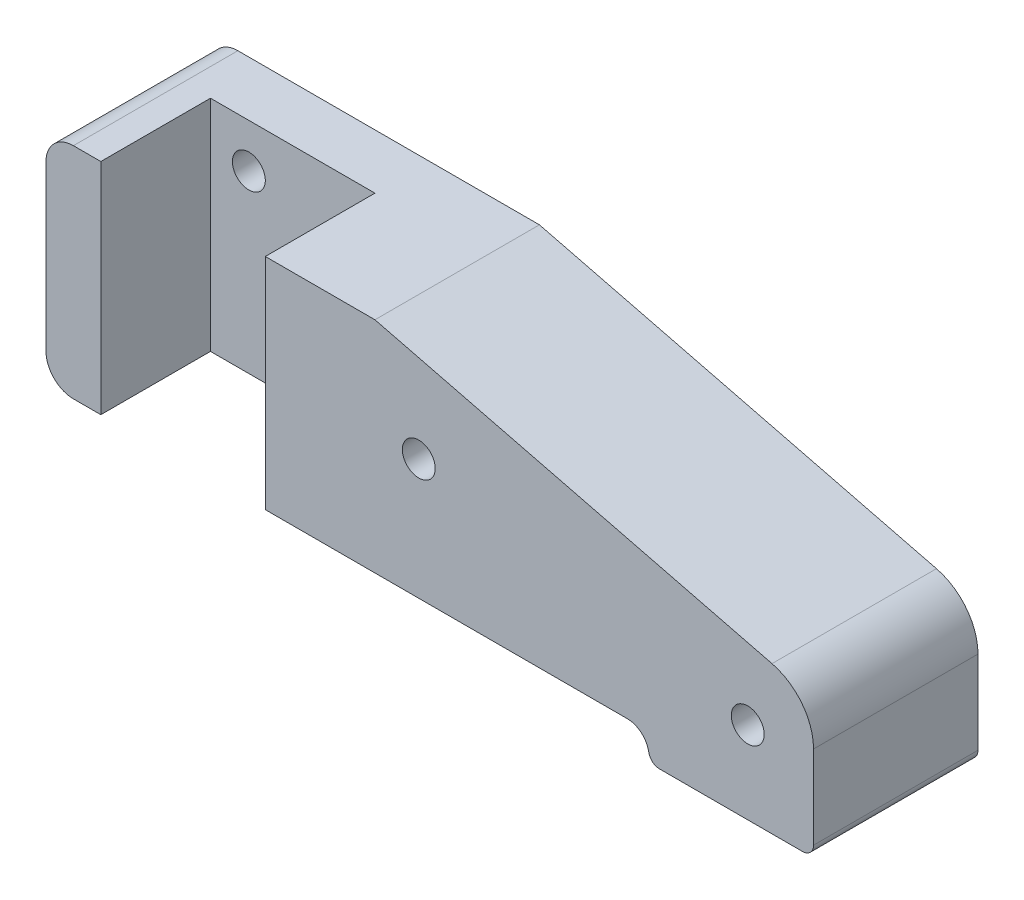
ISO-10303-21;
HEADER;
FILE_DESCRIPTION(('STEP AP214'),'2;1');
FILE_NAME('part.step','',(''),(''),'','','');
FILE_SCHEMA(('AUTOMOTIVE_DESIGN { 1 0 10303 214 1 1 1 1 }'));
ENDSEC;
DATA;
#1=APPLICATION_CONTEXT('core data for automotive mechanical design processes');
#2=APPLICATION_PROTOCOL_DEFINITION('international standard','automotive_design',2000,#1);
#3=PRODUCT_CONTEXT('',#1,'mechanical');
#4=PRODUCT('Part','Part','',(#3));
#5=PRODUCT_RELATED_PRODUCT_CATEGORY('part','',(#4));
#6=PRODUCT_DEFINITION_FORMATION('','',#4);
#7=PRODUCT_DEFINITION_CONTEXT('part definition',#1,'design');
#8=PRODUCT_DEFINITION('design','',#6,#7);
#9=PRODUCT_DEFINITION_SHAPE('','',#8);
#10=(LENGTH_UNIT() NAMED_UNIT(*) SI_UNIT(.MILLI.,.METRE.));
#11=(NAMED_UNIT(*) PLANE_ANGLE_UNIT() SI_UNIT($,.RADIAN.));
#12=(NAMED_UNIT(*) SI_UNIT($,.STERADIAN.) SOLID_ANGLE_UNIT());
#13=UNCERTAINTY_MEASURE_WITH_UNIT(LENGTH_MEASURE(1.E-05),#10,'distance_accuracy_value','');
#14=(GEOMETRIC_REPRESENTATION_CONTEXT(3) GLOBAL_UNCERTAINTY_ASSIGNED_CONTEXT((#13)) GLOBAL_UNIT_ASSIGNED_CONTEXT((#10,
#11,#12)) REPRESENTATION_CONTEXT('',''));
#15=CARTESIAN_POINT('',(0.,0.,0.));
#16=DIRECTION('',(0.,0.,1.));
#17=DIRECTION('',(1.,0.,0.));
#18=AXIS2_PLACEMENT_3D('',#15,#16,#17);
#19=CARTESIAN_POINT('',(0.,0.,30.));
#20=DIRECTION('',(0.,0.,-1.));
#21=DIRECTION('',(-1.,0.,0.));
#22=AXIS2_PLACEMENT_3D('',#19,#20,#21);
#23=PLANE('',#22);
#24=DIRECTION('',(-1.,0.,0.));
#25=VECTOR('',#24,1.);
#26=CARTESIAN_POINT('',(0.,40.,30.));
#27=LINE('',#26,#25);
#28=CARTESIAN_POINT('',(10.,40.,30.));
#29=VERTEX_POINT('',#28);
#30=CARTESIAN_POINT('',(5.,40.,30.));
#31=VERTEX_POINT('',#30);
#32=EDGE_CURVE('E184',#29,#31,#27,.T.);
#33=ORIENTED_EDGE('',*,*,#32,.T.);
#34=CARTESIAN_POINT('',(5.,35.,30.));
#35=DIRECTION('',(0.,0.,-1.));
#36=DIRECTION('',(-1.,0.,0.));
#37=AXIS2_PLACEMENT_3D('',#34,#35,#36);
#38=CIRCLE('',#37,5.);
#39=CARTESIAN_POINT('',(0.,35.,30.));
#40=VERTEX_POINT('',#39);
#41=EDGE_CURVE('E41',#31,#40,#38,.F.);
#42=ORIENTED_EDGE('',*,*,#41,.T.);
#43=DIRECTION('',(0.,-1.,0.));
#44=VECTOR('',#43,1.);
#45=CARTESIAN_POINT('',(0.,0.,30.));
#46=LINE('',#45,#44);
#47=CARTESIAN_POINT('',(0.,5.,30.));
#48=VERTEX_POINT('',#47);
#49=EDGE_CURVE('E172',#40,#48,#46,.T.);
#50=ORIENTED_EDGE('',*,*,#49,.T.);
#51=CARTESIAN_POINT('',(5.,5.,30.));
#52=DIRECTION('',(0.,0.,-1.));
#53=DIRECTION('',(-1.,0.,0.));
#54=AXIS2_PLACEMENT_3D('',#51,#52,#53);
#55=CIRCLE('',#54,5.);
#56=CARTESIAN_POINT('',(5.,0.,30.));
#57=VERTEX_POINT('',#56);
#58=EDGE_CURVE('E48',#48,#57,#55,.F.);
#59=ORIENTED_EDGE('',*,*,#58,.T.);
#60=DIRECTION('',(1.,0.,0.));
#61=VECTOR('',#60,1.);
#62=CARTESIAN_POINT('',(0.,0.,30.));
#63=LINE('',#62,#61);
#64=CARTESIAN_POINT('',(10.,0.,30.));
#65=VERTEX_POINT('',#64);
#66=EDGE_CURVE('E346',#57,#65,#63,.T.);
#67=ORIENTED_EDGE('',*,*,#66,.T.);
#68=DIRECTION('',(0.,-1.,0.));
#69=VECTOR('',#68,1.);
#70=CARTESIAN_POINT('',(10.,0.,30.));
#71=LINE('',#70,#69);
#72=EDGE_CURVE('E327',#29,#65,#71,.T.);
#73=ORIENTED_EDGE('',*,*,#72,.F.);
#74=EDGE_LOOP('',(#33,#42,#50,#59,#67,#73));
#75=FACE_BOUND('',#74,.T.);
#76=ADVANCED_FACE('F33',(#75),#23,.F.);
#77=CARTESIAN_POINT('',(0.,0.,30.));
#78=DIRECTION('',(1.,0.,0.));
#79=DIRECTION('',(0.,0.,-1.));
#80=AXIS2_PLACEMENT_3D('',#77,#78,#79);
#81=PLANE('',#80);
#82=ORIENTED_EDGE('',*,*,#49,.F.);
#83=DIRECTION('',(0.,0.,-1.));
#84=VECTOR('',#83,1.);
#85=CARTESIAN_POINT('',(0.,35.,30.));
#86=LINE('',#85,#84);
#87=CARTESIAN_POINT('',(0.,35.,0.));
#88=VERTEX_POINT('',#87);
#89=EDGE_CURVE('E241',#40,#88,#86,.T.);
#90=ORIENTED_EDGE('',*,*,#89,.T.);
#91=DIRECTION('',(0.,-1.,0.));
#92=VECTOR('',#91,1.);
#93=CARTESIAN_POINT('',(0.,0.,0.));
#94=LINE('',#93,#92);
#95=CARTESIAN_POINT('',(0.,5.,0.));
#96=VERTEX_POINT('',#95);
#97=EDGE_CURVE('E192',#88,#96,#94,.T.);
#98=ORIENTED_EDGE('',*,*,#97,.T.);
#99=DIRECTION('',(0.,0.,-1.));
#100=VECTOR('',#99,1.);
#101=CARTESIAN_POINT('',(0.,5.,30.));
#102=LINE('',#101,#100);
#103=EDGE_CURVE('E239',#96,#48,#102,.F.);
#104=ORIENTED_EDGE('',*,*,#103,.T.);
#105=EDGE_LOOP('',(#82,#90,#98,#104));
#106=FACE_BOUND('',#105,.T.);
#107=ADVANCED_FACE('F254',(#106),#81,.F.);
#108=CARTESIAN_POINT('',(0.,0.,30.));
#109=DIRECTION('',(0.,1.,0.));
#110=DIRECTION('',(0.,0.,1.));
#111=AXIS2_PLACEMENT_3D('',#108,#109,#110);
#112=PLANE('',#111);
#113=ORIENTED_EDGE('',*,*,#66,.F.);
#114=DIRECTION('',(0.,0.,-1.));
#115=VECTOR('',#114,1.);
#116=CARTESIAN_POINT('',(5.,0.,30.));
#117=LINE('',#116,#115);
#118=CARTESIAN_POINT('',(5.,0.,0.));
#119=VERTEX_POINT('',#118);
#120=EDGE_CURVE('E11',#57,#119,#117,.T.);
#121=ORIENTED_EDGE('',*,*,#120,.T.);
#122=DIRECTION('',(1.,0.,0.));
#123=VECTOR('',#122,1.);
#124=CARTESIAN_POINT('',(0.,0.,0.));
#125=LINE('',#124,#123);
#126=CARTESIAN_POINT('',(106.,0.,0.));
#127=VERTEX_POINT('',#126);
#128=EDGE_CURVE('E177',#119,#127,#125,.T.);
#129=ORIENTED_EDGE('',*,*,#128,.T.);
#130=DIRECTION('',(0.,0.,1.));
#131=VECTOR('',#130,1.);
#132=CARTESIAN_POINT('',(106.,0.,30.));
#133=LINE('',#132,#131);
#134=CARTESIAN_POINT('',(106.,0.,30.));
#135=VERTEX_POINT('',#134);
#136=EDGE_CURVE('E202',#127,#135,#133,.T.);
#137=ORIENTED_EDGE('',*,*,#136,.T.);
#138=CARTESIAN_POINT('',(40.,0.,30.));
#139=VERTEX_POINT('',#138);
#140=EDGE_CURVE('E175',#139,#135,#63,.T.);
#141=ORIENTED_EDGE('',*,*,#140,.F.);
#142=DIRECTION('',(0.,0.,1.));
#143=VECTOR('',#142,1.);
#144=CARTESIAN_POINT('',(40.,0.,10.));
#145=LINE('',#144,#143);
#146=CARTESIAN_POINT('',(40.,0.,10.));
#147=VERTEX_POINT('',#146);
#148=EDGE_CURVE('E351',#147,#139,#145,.T.);
#149=ORIENTED_EDGE('',*,*,#148,.F.);
#150=DIRECTION('',(1.,0.,0.));
#151=VECTOR('',#150,1.);
#152=CARTESIAN_POINT('',(10.,0.,10.));
#153=LINE('',#152,#151);
#154=CARTESIAN_POINT('',(10.,0.,10.));
#155=VERTEX_POINT('',#154);
#156=EDGE_CURVE('E364',#155,#147,#153,.T.);
#157=ORIENTED_EDGE('',*,*,#156,.F.);
#158=DIRECTION('',(0.,0.,1.));
#159=VECTOR('',#158,1.);
#160=CARTESIAN_POINT('',(10.,0.,10.));
#161=LINE('',#160,#159);
#162=EDGE_CURVE('E348',#155,#65,#161,.T.);
#163=ORIENTED_EDGE('',*,*,#162,.T.);
#164=EDGE_LOOP('',(#113,#121,#129,#137,#141,#149,#157,#163));
#165=FACE_BOUND('',#164,.T.);
#166=ADVANCED_FACE('F199',(#165),#112,.F.);
#167=CARTESIAN_POINT('',(140.,0.,30.));
#168=DIRECTION('',(-1.,0.,0.));
#169=DIRECTION('',(0.,0.,1.));
#170=AXIS2_PLACEMENT_3D('',#167,#168,#169);
#171=PLANE('',#170);
#172=DIRECTION('',(0.,1.,0.));
#173=VECTOR('',#172,1.);
#174=CARTESIAN_POINT('',(140.,0.,30.));
#175=LINE('',#174,#173);
#176=CARTESIAN_POINT('',(140.,-3.,30.));
#177=VERTEX_POINT('',#176);
#178=CARTESIAN_POINT('',(140.,12.1922359359559,30.));
#179=VERTEX_POINT('',#178);
#180=EDGE_CURVE('E190',#177,#179,#175,.T.);
#181=ORIENTED_EDGE('',*,*,#180,.F.);
#182=DIRECTION('',(0.,0.,1.));
#183=VECTOR('',#182,1.);
#184=CARTESIAN_POINT('',(140.,-3.,0.));
#185=LINE('',#184,#183);
#186=CARTESIAN_POINT('',(140.,-3.,0.));
#187=VERTEX_POINT('',#186);
#188=EDGE_CURVE('E232',#177,#187,#185,.F.);
#189=ORIENTED_EDGE('',*,*,#188,.T.);
#190=DIRECTION('',(0.,1.,0.));
#191=VECTOR('',#190,1.);
#192=CARTESIAN_POINT('',(140.,0.,0.));
#193=LINE('',#192,#191);
#194=CARTESIAN_POINT('',(140.,12.1922359359559,0.));
#195=VERTEX_POINT('',#194);
#196=EDGE_CURVE('E173',#187,#195,#193,.T.);
#197=ORIENTED_EDGE('',*,*,#196,.T.);
#198=DIRECTION('',(0.,0.,1.));
#199=VECTOR('',#198,1.);
#200=CARTESIAN_POINT('',(140.,12.1922359359559,30.));
#201=LINE('',#200,#199);
#202=EDGE_CURVE('E183',#195,#179,#201,.T.);
#203=ORIENTED_EDGE('',*,*,#202,.T.);
#204=EDGE_LOOP('',(#181,#189,#197,#203));
#205=FACE_BOUND('',#204,.T.);
#206=ADVANCED_FACE('F287',(#205),#171,.F.);
#207=CARTESIAN_POINT('',(0.,40.,30.));
#208=DIRECTION('',(0.,-1.,0.));
#209=DIRECTION('',(0.,0.,-1.));
#210=AXIS2_PLACEMENT_3D('',#207,#208,#209);
#211=PLANE('',#210);
#212=DIRECTION('',(-1.,0.,0.));
#213=VECTOR('',#212,1.);
#214=CARTESIAN_POINT('',(0.,40.,0.));
#215=LINE('',#214,#213);
#216=CARTESIAN_POINT('',(60.,40.,0.));
#217=VERTEX_POINT('',#216);
#218=CARTESIAN_POINT('',(5.,40.,0.));
#219=VERTEX_POINT('',#218);
#220=EDGE_CURVE('E164',#217,#219,#215,.T.);
#221=ORIENTED_EDGE('',*,*,#220,.T.);
#222=DIRECTION('',(0.,0.,-1.));
#223=VECTOR('',#222,1.);
#224=CARTESIAN_POINT('',(5.,40.,30.));
#225=LINE('',#224,#223);
#226=EDGE_CURVE('E56',#219,#31,#225,.F.);
#227=ORIENTED_EDGE('',*,*,#226,.T.);
#228=ORIENTED_EDGE('',*,*,#32,.F.);
#229=DIRECTION('',(0.,0.,1.));
#230=VECTOR('',#229,1.);
#231=CARTESIAN_POINT('',(10.,40.,10.));
#232=LINE('',#231,#230);
#233=CARTESIAN_POINT('',(10.,40.,10.));
#234=VERTEX_POINT('',#233);
#235=EDGE_CURVE('E194',#234,#29,#232,.T.);
#236=ORIENTED_EDGE('',*,*,#235,.F.);
#237=DIRECTION('',(-1.,0.,0.));
#238=VECTOR('',#237,1.);
#239=CARTESIAN_POINT('',(10.,40.,10.));
#240=LINE('',#239,#238);
#241=CARTESIAN_POINT('',(40.,40.,10.));
#242=VERTEX_POINT('',#241);
#243=EDGE_CURVE('E352',#242,#234,#240,.T.);
#244=ORIENTED_EDGE('',*,*,#243,.F.);
#245=DIRECTION('',(0.,0.,1.));
#246=VECTOR('',#245,1.);
#247=CARTESIAN_POINT('',(40.,40.,10.));
#248=LINE('',#247,#246);
#249=CARTESIAN_POINT('',(40.,40.,30.));
#250=VERTEX_POINT('',#249);
#251=EDGE_CURVE('E354',#242,#250,#248,.T.);
#252=ORIENTED_EDGE('',*,*,#251,.T.);
#253=CARTESIAN_POINT('',(60.,40.,30.));
#254=VERTEX_POINT('',#253);
#255=EDGE_CURVE('E166',#254,#250,#27,.T.);
#256=ORIENTED_EDGE('',*,*,#255,.F.);
#257=DIRECTION('',(0.,0.,1.));
#258=VECTOR('',#257,1.);
#259=CARTESIAN_POINT('',(60.,40.,0.));
#260=LINE('',#259,#258);
#261=EDGE_CURVE('E153',#217,#254,#260,.T.);
#262=ORIENTED_EDGE('',*,*,#261,.F.);
#263=EDGE_LOOP('',(#221,#227,#228,#236,#244,#252,#256,#262));
#264=FACE_BOUND('',#263,.T.);
#265=ADVANCED_FACE('F163',(#264),#211,.F.);
#266=CARTESIAN_POINT('',(68.,22.,30.));
#267=DIRECTION('',(0.,0.,-1.));
#268=DIRECTION('',(-1.,0.,0.));
#269=AXIS2_PLACEMENT_3D('',#266,#267,#268);
#270=CIRCLE('',#269,3.00000000000001);
#271=CARTESIAN_POINT('',(65.,22.,30.));
#272=VERTEX_POINT('',#271);
#273=EDGE_CURVE('E161',#272,#272,#270,.T.);
#274=ORIENTED_EDGE('',*,*,#273,.T.);
#275=EDGE_LOOP('',(#274));
#276=FACE_BOUND('',#275,.T.);
#277=CARTESIAN_POINT('',(128.,10.,30.));
#278=DIRECTION('',(0.,0.,-1.));
#279=DIRECTION('',(-1.,0.,0.));
#280=AXIS2_PLACEMENT_3D('',#277,#278,#279);
#281=CIRCLE('',#280,2.99999999999999);
#282=CARTESIAN_POINT('',(125.,10.,30.));
#283=VERTEX_POINT('',#282);
#284=EDGE_CURVE('E295',#283,#283,#281,.T.);
#285=ORIENTED_EDGE('',*,*,#284,.T.);
#286=EDGE_LOOP('',(#285));
#287=FACE_BOUND('',#286,.T.);
#288=DIRECTION('',(1.,0.,0.));
#289=VECTOR('',#288,1.);
#290=CARTESIAN_POINT('',(140.,-5.,30.));
#291=LINE('',#290,#289);
#292=CARTESIAN_POINT('',(111.9160797831,-5.,30.));
#293=VERTEX_POINT('',#292);
#294=CARTESIAN_POINT('',(138.,-5.,30.));
#295=VERTEX_POINT('',#294);
#296=EDGE_CURVE('E298',#293,#295,#291,.T.);
#297=ORIENTED_EDGE('',*,*,#296,.T.);
#298=CARTESIAN_POINT('',(138.,-3.,30.));
#299=DIRECTION('',(0.,0.,-1.));
#300=DIRECTION('',(-1.,0.,0.));
#301=AXIS2_PLACEMENT_3D('',#298,#299,#300);
#302=CIRCLE('',#301,2.);
#303=EDGE_CURVE('E230',#295,#177,#302,.F.);
#304=ORIENTED_EDGE('',*,*,#303,.T.);
#305=ORIENTED_EDGE('',*,*,#180,.T.);
#306=CARTESIAN_POINT('',(130.,12.1922359359559,30.));
#307=DIRECTION('',(0.,0.,-1.));
#308=DIRECTION('',(-1.,0.,0.));
#309=AXIS2_PLACEMENT_3D('',#306,#307,#308);
#310=CIRCLE('',#309,10.);
#311=CARTESIAN_POINT('',(132.425356250363,21.8936609374092,30.));
#312=VERTEX_POINT('',#311);
#313=EDGE_CURVE('E329',#179,#312,#310,.F.);
#314=ORIENTED_EDGE('',*,*,#313,.T.);
#315=DIRECTION('',(-0.970142500145332,0.242535625036333,0.));
#316=VECTOR('',#315,1.);
#317=CARTESIAN_POINT('',(12.9411764705882,51.7647058823529,30.));
#318=LINE('',#317,#316);
#319=EDGE_CURVE('E167',#312,#254,#318,.T.);
#320=ORIENTED_EDGE('',*,*,#319,.T.);
#321=ORIENTED_EDGE('',*,*,#255,.T.);
#322=DIRECTION('',(0.,1.,0.));
#323=VECTOR('',#322,1.);
#324=CARTESIAN_POINT('',(40.,0.,30.));
#325=LINE('',#324,#323);
#326=EDGE_CURVE('E344',#139,#250,#325,.T.);
#327=ORIENTED_EDGE('',*,*,#326,.F.);
#328=ORIENTED_EDGE('',*,*,#140,.T.);
#329=CARTESIAN_POINT('',(106.,-4.,30.));
#330=DIRECTION('',(0.,0.,-1.));
#331=DIRECTION('',(-1.,0.,0.));
#332=AXIS2_PLACEMENT_3D('',#329,#330,#331);
#333=CIRCLE('',#332,4.);
#334=CARTESIAN_POINT('',(109.944053188733,-3.33333333333333,30.));
#335=VERTEX_POINT('',#334);
#336=EDGE_CURVE('E214',#135,#335,#333,.T.);
#337=ORIENTED_EDGE('',*,*,#336,.T.);
#338=CARTESIAN_POINT('',(111.9160797831,-3.,30.));
#339=DIRECTION('',(0.,0.,-1.));
#340=DIRECTION('',(-1.,0.,0.));
#341=AXIS2_PLACEMENT_3D('',#338,#339,#340);
#342=CIRCLE('',#341,2.);
#343=EDGE_CURVE('E228',#335,#293,#342,.F.);
#344=ORIENTED_EDGE('',*,*,#343,.T.);
#345=EDGE_LOOP('',(#297,#304,#305,#314,#320,#321,#327,#328,#337,#344));
#346=FACE_BOUND('',#345,.T.);
#347=ADVANCED_FACE('F269',(#276,#287,#346),#23,.F.);
#348=CARTESIAN_POINT('',(0.,0.,0.));
#349=DIRECTION('',(0.,0.,-1.));
#350=DIRECTION('',(-1.,0.,0.));
#351=AXIS2_PLACEMENT_3D('',#348,#349,#350);
#352=PLANE('',#351);
#353=CARTESIAN_POINT('',(17.,32.,0.));
#354=DIRECTION('',(0.,0.,-1.));
#355=DIRECTION('',(-1.,0.,0.));
#356=AXIS2_PLACEMENT_3D('',#353,#354,#355);
#357=CIRCLE('',#356,3.);
#358=CARTESIAN_POINT('',(14.,32.,0.));
#359=VERTEX_POINT('',#358);
#360=EDGE_CURVE('E311',#359,#359,#357,.T.);
#361=ORIENTED_EDGE('',*,*,#360,.F.);
#362=EDGE_LOOP('',(#361));
#363=FACE_BOUND('',#362,.T.);
#364=CARTESIAN_POINT('',(33.,8.,0.));
#365=DIRECTION('',(0.,0.,-1.));
#366=DIRECTION('',(-1.,0.,0.));
#367=AXIS2_PLACEMENT_3D('',#364,#365,#366);
#368=CIRCLE('',#367,3.);
#369=CARTESIAN_POINT('',(30.,8.,0.));
#370=VERTEX_POINT('',#369);
#371=EDGE_CURVE('E307',#370,#370,#368,.T.);
#372=ORIENTED_EDGE('',*,*,#371,.F.);
#373=EDGE_LOOP('',(#372));
#374=FACE_BOUND('',#373,.T.);
#375=CARTESIAN_POINT('',(68.,22.,0.));
#376=DIRECTION('',(0.,0.,-1.));
#377=DIRECTION('',(-1.,0.,0.));
#378=AXIS2_PLACEMENT_3D('',#375,#376,#377);
#379=CIRCLE('',#378,3.00000000000001);
#380=CARTESIAN_POINT('',(65.,22.,0.));
#381=VERTEX_POINT('',#380);
#382=EDGE_CURVE('E316',#381,#381,#379,.T.);
#383=ORIENTED_EDGE('',*,*,#382,.F.);
#384=EDGE_LOOP('',(#383));
#385=FACE_BOUND('',#384,.T.);
#386=CARTESIAN_POINT('',(128.,10.,0.));
#387=DIRECTION('',(0.,0.,-1.));
#388=DIRECTION('',(-1.,0.,0.));
#389=AXIS2_PLACEMENT_3D('',#386,#387,#388);
#390=CIRCLE('',#389,2.99999999999999);
#391=CARTESIAN_POINT('',(125.,10.,0.));
#392=VERTEX_POINT('',#391);
#393=EDGE_CURVE('E314',#392,#392,#390,.T.);
#394=ORIENTED_EDGE('',*,*,#393,.F.);
#395=EDGE_LOOP('',(#394));
#396=FACE_BOUND('',#395,.T.);
#397=ORIENTED_EDGE('',*,*,#97,.F.);
#398=CARTESIAN_POINT('',(5.,35.,0.));
#399=DIRECTION('',(0.,0.,-1.));
#400=DIRECTION('',(-1.,0.,0.));
#401=AXIS2_PLACEMENT_3D('',#398,#399,#400);
#402=CIRCLE('',#401,5.);
#403=EDGE_CURVE('E171',#88,#219,#402,.T.);
#404=ORIENTED_EDGE('',*,*,#403,.T.);
#405=ORIENTED_EDGE('',*,*,#220,.F.);
#406=DIRECTION('',(0.970142500145332,-0.242535625036333,0.));
#407=VECTOR('',#406,1.);
#408=CARTESIAN_POINT('',(140.,20.,0.));
#409=LINE('',#408,#407);
#410=CARTESIAN_POINT('',(132.425356250363,21.8936609374092,0.));
#411=VERTEX_POINT('',#410);
#412=EDGE_CURVE('E149',#217,#411,#409,.T.);
#413=ORIENTED_EDGE('',*,*,#412,.T.);
#414=CARTESIAN_POINT('',(130.,12.1922359359559,0.));
#415=DIRECTION('',(0.,0.,-1.));
#416=DIRECTION('',(-1.,0.,0.));
#417=AXIS2_PLACEMENT_3D('',#414,#415,#416);
#418=CIRCLE('',#417,10.);
#419=EDGE_CURVE('E218',#411,#195,#418,.T.);
#420=ORIENTED_EDGE('',*,*,#419,.T.);
#421=ORIENTED_EDGE('',*,*,#196,.F.);
#422=CARTESIAN_POINT('',(138.,-3.,0.));
#423=DIRECTION('',(0.,0.,-1.));
#424=DIRECTION('',(-1.,0.,0.));
#425=AXIS2_PLACEMENT_3D('',#422,#423,#424);
#426=CIRCLE('',#425,2.);
#427=CARTESIAN_POINT('',(138.,-5.,0.));
#428=VERTEX_POINT('',#427);
#429=EDGE_CURVE('E235',#187,#428,#426,.T.);
#430=ORIENTED_EDGE('',*,*,#429,.T.);
#431=DIRECTION('',(1.,0.,0.));
#432=VECTOR('',#431,1.);
#433=CARTESIAN_POINT('',(140.,-5.,0.));
#434=LINE('',#433,#432);
#435=CARTESIAN_POINT('',(111.9160797831,-5.,0.));
#436=VERTEX_POINT('',#435);
#437=EDGE_CURVE('E302',#436,#428,#434,.T.);
#438=ORIENTED_EDGE('',*,*,#437,.F.);
#439=CARTESIAN_POINT('',(111.9160797831,-3.,0.));
#440=DIRECTION('',(0.,0.,-1.));
#441=DIRECTION('',(-1.,0.,0.));
#442=AXIS2_PLACEMENT_3D('',#439,#440,#441);
#443=CIRCLE('',#442,2.);
#444=CARTESIAN_POINT('',(109.944053188733,-3.33333333333333,0.));
#445=VERTEX_POINT('',#444);
#446=EDGE_CURVE('E209',#436,#445,#443,.T.);
#447=ORIENTED_EDGE('',*,*,#446,.T.);
#448=CARTESIAN_POINT('',(106.,-4.,0.));
#449=DIRECTION('',(0.,0.,-1.));
#450=DIRECTION('',(-1.,0.,0.));
#451=AXIS2_PLACEMENT_3D('',#448,#449,#450);
#452=CIRCLE('',#451,4.);
#453=EDGE_CURVE('E206',#445,#127,#452,.F.);
#454=ORIENTED_EDGE('',*,*,#453,.T.);
#455=ORIENTED_EDGE('',*,*,#128,.F.);
#456=CARTESIAN_POINT('',(5.,5.,0.));
#457=DIRECTION('',(0.,0.,-1.));
#458=DIRECTION('',(-1.,0.,0.));
#459=AXIS2_PLACEMENT_3D('',#456,#457,#458);
#460=CIRCLE('',#459,5.);
#461=EDGE_CURVE('E244',#119,#96,#460,.T.);
#462=ORIENTED_EDGE('',*,*,#461,.T.);
#463=EDGE_LOOP('',(#397,#404,#405,#413,#420,#421,#430,#438,#447,#454,#455,#462));
#464=FACE_BOUND('',#463,.T.);
#465=ADVANCED_FACE('F170',(#363,#374,#385,#396,#464),#352,.T.);
#466=CARTESIAN_POINT('',(10.,0.,10.));
#467=DIRECTION('',(-1.,0.,0.));
#468=DIRECTION('',(0.,0.,1.));
#469=AXIS2_PLACEMENT_3D('',#466,#467,#468);
#470=PLANE('',#469);
#471=ORIENTED_EDGE('',*,*,#72,.T.);
#472=ORIENTED_EDGE('',*,*,#162,.F.);
#473=DIRECTION('',(0.,-1.,0.));
#474=VECTOR('',#473,1.);
#475=CARTESIAN_POINT('',(10.,0.,10.));
#476=LINE('',#475,#474);
#477=EDGE_CURVE('E322',#234,#155,#476,.T.);
#478=ORIENTED_EDGE('',*,*,#477,.F.);
#479=ORIENTED_EDGE('',*,*,#235,.T.);
#480=EDGE_LOOP('',(#471,#472,#478,#479));
#481=FACE_BOUND('',#480,.T.);
#482=ADVANCED_FACE('F284',(#481),#470,.F.);
#483=CARTESIAN_POINT('',(40.,0.,10.));
#484=DIRECTION('',(1.,0.,0.));
#485=DIRECTION('',(0.,1.,0.));
#486=AXIS2_PLACEMENT_3D('',#483,#484,#485);
#487=PLANE('',#486);
#488=ORIENTED_EDGE('',*,*,#326,.T.);
#489=ORIENTED_EDGE('',*,*,#251,.F.);
#490=DIRECTION('',(0.,1.,0.));
#491=VECTOR('',#490,1.);
#492=CARTESIAN_POINT('',(40.,0.,10.));
#493=LINE('',#492,#491);
#494=EDGE_CURVE('E362',#147,#242,#493,.T.);
#495=ORIENTED_EDGE('',*,*,#494,.F.);
#496=ORIENTED_EDGE('',*,*,#148,.T.);
#497=EDGE_LOOP('',(#488,#489,#495,#496));
#498=FACE_BOUND('',#497,.T.);
#499=ADVANCED_FACE('F374',(#498),#487,.F.);
#500=CARTESIAN_POINT('',(0.,0.,10.));
#501=DIRECTION('',(0.,0.,-1.));
#502=DIRECTION('',(-1.,0.,0.));
#503=AXIS2_PLACEMENT_3D('',#500,#501,#502);
#504=PLANE('',#503);
#505=CARTESIAN_POINT('',(17.,32.,10.));
#506=DIRECTION('',(0.,0.,-1.));
#507=DIRECTION('',(-1.,0.,0.));
#508=AXIS2_PLACEMENT_3D('',#505,#506,#507);
#509=CIRCLE('',#508,3.);
#510=CARTESIAN_POINT('',(14.,32.,10.));
#511=VERTEX_POINT('',#510);
#512=EDGE_CURVE('E310',#511,#511,#509,.T.);
#513=ORIENTED_EDGE('',*,*,#512,.T.);
#514=EDGE_LOOP('',(#513));
#515=FACE_BOUND('',#514,.T.);
#516=CARTESIAN_POINT('',(33.,8.,10.));
#517=DIRECTION('',(0.,0.,-1.));
#518=DIRECTION('',(-1.,0.,0.));
#519=AXIS2_PLACEMENT_3D('',#516,#517,#518);
#520=CIRCLE('',#519,3.);
#521=CARTESIAN_POINT('',(30.,8.,10.));
#522=VERTEX_POINT('',#521);
#523=EDGE_CURVE('E185',#522,#522,#520,.T.);
#524=ORIENTED_EDGE('',*,*,#523,.T.);
#525=EDGE_LOOP('',(#524));
#526=FACE_BOUND('',#525,.T.);
#527=ORIENTED_EDGE('',*,*,#477,.T.);
#528=ORIENTED_EDGE('',*,*,#156,.T.);
#529=ORIENTED_EDGE('',*,*,#494,.T.);
#530=ORIENTED_EDGE('',*,*,#243,.T.);
#531=EDGE_LOOP('',(#527,#528,#529,#530));
#532=FACE_BOUND('',#531,.T.);
#533=ADVANCED_FACE('F369',(#515,#526,#532),#504,.F.);
#534=CARTESIAN_POINT('',(140.,20.,0.));
#535=DIRECTION('',(-0.242535625036333,-0.970142500145332,0.));
#536=DIRECTION('',(0.970142500145332,-0.242535625036333,0.));
#537=AXIS2_PLACEMENT_3D('',#534,#535,#536);
#538=PLANE('',#537);
#539=ORIENTED_EDGE('',*,*,#319,.F.);
#540=DIRECTION('',(0.,0.,1.));
#541=VECTOR('',#540,1.);
#542=CARTESIAN_POINT('',(132.425356250363,21.8936609374092,0.));
#543=LINE('',#542,#541);
#544=EDGE_CURVE('E156',#312,#411,#543,.F.);
#545=ORIENTED_EDGE('',*,*,#544,.T.);
#546=ORIENTED_EDGE('',*,*,#412,.F.);
#547=ORIENTED_EDGE('',*,*,#261,.T.);
#548=EDGE_LOOP('',(#539,#545,#546,#547));
#549=FACE_BOUND('',#548,.T.);
#550=ADVANCED_FACE('F152',(#549),#538,.F.);
#551=CARTESIAN_POINT('',(33.,8.,-2.50000000007189E-05));
#552=DIRECTION('',(0.,0.,1.));
#553=DIRECTION('',(1.,0.,0.));
#554=AXIS2_PLACEMENT_3D('',#551,#552,#553);
#555=CYLINDRICAL_SURFACE('',#554,3.);
#556=ORIENTED_EDGE('',*,*,#371,.T.);
#557=EDGE_LOOP('',(#556));
#558=FACE_BOUND('',#557,.T.);
#559=ORIENTED_EDGE('',*,*,#523,.F.);
#560=EDGE_LOOP('',(#559));
#561=FACE_BOUND('',#560,.T.);
#562=ADVANCED_FACE('F387',(#558,#561),#555,.F.);
#563=CARTESIAN_POINT('',(17.,32.,-2.50000000007189E-05));
#564=DIRECTION('',(0.,0.,1.));
#565=DIRECTION('',(1.,0.,0.));
#566=AXIS2_PLACEMENT_3D('',#563,#564,#565);
#567=CYLINDRICAL_SURFACE('',#566,3.);
#568=ORIENTED_EDGE('',*,*,#360,.T.);
#569=EDGE_LOOP('',(#568));
#570=FACE_BOUND('',#569,.T.);
#571=ORIENTED_EDGE('',*,*,#512,.F.);
#572=EDGE_LOOP('',(#571));
#573=FACE_BOUND('',#572,.T.);
#574=ADVANCED_FACE('F392',(#570,#573),#567,.F.);
#575=CARTESIAN_POINT('',(128.,10.,-2.50000000007189E-05));
#576=DIRECTION('',(0.,0.,1.));
#577=DIRECTION('',(1.,0.,0.));
#578=AXIS2_PLACEMENT_3D('',#575,#576,#577);
#579=CYLINDRICAL_SURFACE('',#578,2.99999999999999);
#580=ORIENTED_EDGE('',*,*,#393,.T.);
#581=EDGE_LOOP('',(#580));
#582=FACE_BOUND('',#581,.T.);
#583=ORIENTED_EDGE('',*,*,#284,.F.);
#584=EDGE_LOOP('',(#583));
#585=FACE_BOUND('',#584,.T.);
#586=ADVANCED_FACE('F388',(#582,#585),#579,.F.);
#587=CARTESIAN_POINT('',(68.,22.,-2.50000000007189E-05));
#588=DIRECTION('',(0.,0.,1.));
#589=DIRECTION('',(1.,0.,0.));
#590=AXIS2_PLACEMENT_3D('',#587,#588,#589);
#591=CYLINDRICAL_SURFACE('',#590,3.00000000000001);
#592=ORIENTED_EDGE('',*,*,#382,.T.);
#593=EDGE_LOOP('',(#592));
#594=FACE_BOUND('',#593,.T.);
#595=ORIENTED_EDGE('',*,*,#273,.F.);
#596=EDGE_LOOP('',(#595));
#597=FACE_BOUND('',#596,.T.);
#598=ADVANCED_FACE('F391',(#594,#597),#591,.F.);
#599=CARTESIAN_POINT('',(130.,12.1922359359559,30.));
#600=DIRECTION('',(0.,0.,1.));
#601=DIRECTION('',(1.,0.,0.));
#602=AXIS2_PLACEMENT_3D('',#599,#600,#601);
#603=CYLINDRICAL_SURFACE('',#602,10.);
#604=ORIENTED_EDGE('',*,*,#419,.F.);
#605=ORIENTED_EDGE('',*,*,#544,.F.);
#606=ORIENTED_EDGE('',*,*,#313,.F.);
#607=ORIENTED_EDGE('',*,*,#202,.F.);
#608=EDGE_LOOP('',(#604,#605,#606,#607));
#609=FACE_BOUND('',#608,.T.);
#610=ADVANCED_FACE('F337',(#609),#603,.T.);
#611=CARTESIAN_POINT('',(140.,-5.,0.));
#612=DIRECTION('',(0.,-1.,0.));
#613=DIRECTION('',(1.,0.,0.));
#614=AXIS2_PLACEMENT_3D('',#611,#612,#613);
#615=PLANE('',#614);
#616=ORIENTED_EDGE('',*,*,#437,.T.);
#617=DIRECTION('',(0.,0.,1.));
#618=VECTOR('',#617,1.);
#619=CARTESIAN_POINT('',(138.,-5.,30.));
#620=LINE('',#619,#618);
#621=EDGE_CURVE('E225',#428,#295,#620,.T.);
#622=ORIENTED_EDGE('',*,*,#621,.T.);
#623=ORIENTED_EDGE('',*,*,#296,.F.);
#624=DIRECTION('',(0.,0.,-1.));
#625=VECTOR('',#624,1.);
#626=CARTESIAN_POINT('',(111.9160797831,-5.,0.));
#627=LINE('',#626,#625);
#628=EDGE_CURVE('E213',#293,#436,#627,.T.);
#629=ORIENTED_EDGE('',*,*,#628,.T.);
#630=EDGE_LOOP('',(#616,#622,#623,#629));
#631=FACE_BOUND('',#630,.T.);
#632=ADVANCED_FACE('F341',(#631),#615,.T.);
#633=CARTESIAN_POINT('',(106.,-4.,30.));
#634=DIRECTION('',(0.,0.,1.));
#635=DIRECTION('',(1.,0.,0.));
#636=AXIS2_PLACEMENT_3D('',#633,#634,#635);
#637=CYLINDRICAL_SURFACE('',#636,4.);
#638=ORIENTED_EDGE('',*,*,#453,.F.);
#639=DIRECTION('',(0.,0.,1.));
#640=VECTOR('',#639,1.);
#641=CARTESIAN_POINT('',(109.944053188733,-3.33333333333333,30.));
#642=LINE('',#641,#640);
#643=EDGE_CURVE('E237',#445,#335,#642,.T.);
#644=ORIENTED_EDGE('',*,*,#643,.T.);
#645=ORIENTED_EDGE('',*,*,#336,.F.);
#646=ORIENTED_EDGE('',*,*,#136,.F.);
#647=EDGE_LOOP('',(#638,#644,#645,#646));
#648=FACE_BOUND('',#647,.T.);
#649=ADVANCED_FACE('F216',(#648),#637,.F.);
#650=CARTESIAN_POINT('',(138.,-3.,0.));
#651=DIRECTION('',(0.,0.,-1.));
#652=DIRECTION('',(-1.,0.,0.));
#653=AXIS2_PLACEMENT_3D('',#650,#651,#652);
#654=CYLINDRICAL_SURFACE('',#653,2.);
#655=ORIENTED_EDGE('',*,*,#429,.F.);
#656=ORIENTED_EDGE('',*,*,#188,.F.);
#657=ORIENTED_EDGE('',*,*,#303,.F.);
#658=ORIENTED_EDGE('',*,*,#621,.F.);
#659=EDGE_LOOP('',(#655,#656,#657,#658));
#660=FACE_BOUND('',#659,.T.);
#661=ADVANCED_FACE('F264',(#660),#654,.T.);
#662=CARTESIAN_POINT('',(111.9160797831,-3.,30.));
#663=DIRECTION('',(0.,0.,1.));
#664=DIRECTION('',(1.,0.,0.));
#665=AXIS2_PLACEMENT_3D('',#662,#663,#664);
#666=CYLINDRICAL_SURFACE('',#665,2.);
#667=ORIENTED_EDGE('',*,*,#446,.F.);
#668=ORIENTED_EDGE('',*,*,#628,.F.);
#669=ORIENTED_EDGE('',*,*,#343,.F.);
#670=ORIENTED_EDGE('',*,*,#643,.F.);
#671=EDGE_LOOP('',(#667,#668,#669,#670));
#672=FACE_BOUND('',#671,.T.);
#673=ADVANCED_FACE('F258',(#672),#666,.T.);
#674=CARTESIAN_POINT('',(5.,35.,30.));
#675=DIRECTION('',(0.,0.,-1.));
#676=DIRECTION('',(-1.,0.,0.));
#677=AXIS2_PLACEMENT_3D('',#674,#675,#676);
#678=CYLINDRICAL_SURFACE('',#677,5.);
#679=ORIENTED_EDGE('',*,*,#41,.F.);
#680=ORIENTED_EDGE('',*,*,#226,.F.);
#681=ORIENTED_EDGE('',*,*,#403,.F.);
#682=ORIENTED_EDGE('',*,*,#89,.F.);
#683=EDGE_LOOP('',(#679,#680,#681,#682));
#684=FACE_BOUND('',#683,.T.);
#685=ADVANCED_FACE('F256',(#684),#678,.T.);
#686=CARTESIAN_POINT('',(5.,5.,30.));
#687=DIRECTION('',(0.,0.,-1.));
#688=DIRECTION('',(-1.,0.,0.));
#689=AXIS2_PLACEMENT_3D('',#686,#687,#688);
#690=CYLINDRICAL_SURFACE('',#689,5.);
#691=ORIENTED_EDGE('',*,*,#58,.F.);
#692=ORIENTED_EDGE('',*,*,#103,.F.);
#693=ORIENTED_EDGE('',*,*,#461,.F.);
#694=ORIENTED_EDGE('',*,*,#120,.F.);
#695=EDGE_LOOP('',(#691,#692,#693,#694));
#696=FACE_BOUND('',#695,.T.);
#697=ADVANCED_FACE('F35',(#696),#690,.T.);
#698=CLOSED_SHELL('',(#76,#107,#166,#206,#265,#347,#465,#482,#499,#533,#550,#562,#574,#586,#598,
#610,#632,#649,#661,#673,#685,#697));
#699=MANIFOLD_SOLID_BREP('B2',#698);
#700=ADVANCED_BREP_SHAPE_REPRESENTATION('',(#18,#699),#14);
#701=SHAPE_DEFINITION_REPRESENTATION(#9,#700);
ENDSEC;
END-ISO-10303-21;
